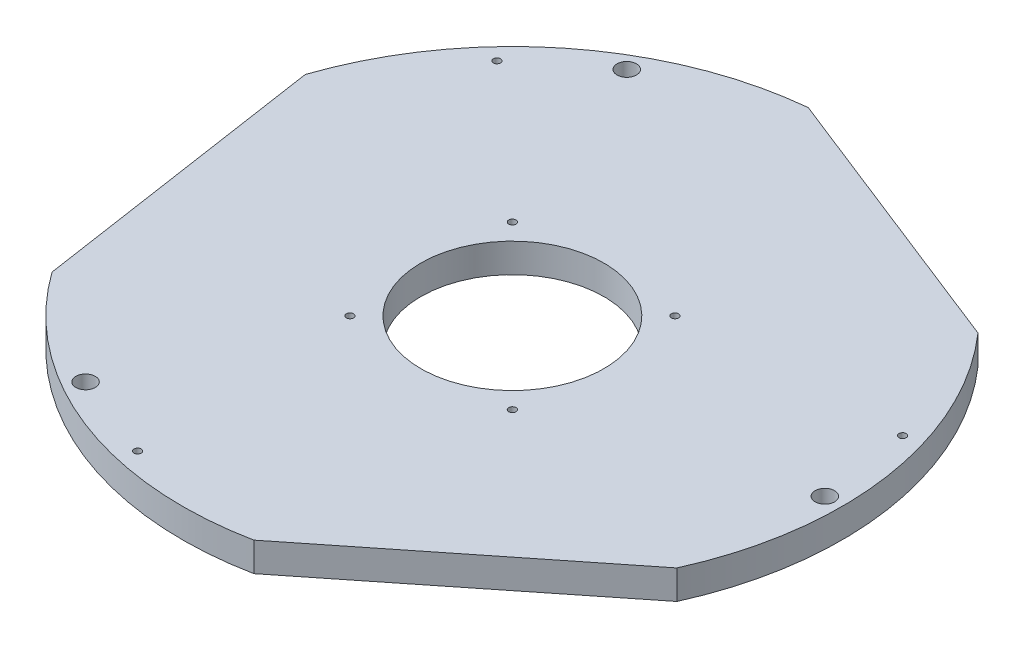
ISO-10303-21;
HEADER;
FILE_DESCRIPTION(('STEP AP214'),'2;1');
FILE_NAME('part.step','',(''),(''),'','','');
FILE_SCHEMA(('AUTOMOTIVE_DESIGN { 1 0 10303 214 1 1 1 1 }'));
ENDSEC;
DATA;
#1=APPLICATION_CONTEXT('core data for automotive mechanical design processes');
#2=APPLICATION_PROTOCOL_DEFINITION('international standard','automotive_design',2000,#1);
#3=PRODUCT_CONTEXT('',#1,'mechanical');
#4=PRODUCT('Part','Part','',(#3));
#5=PRODUCT_RELATED_PRODUCT_CATEGORY('part','',(#4));
#6=PRODUCT_DEFINITION_FORMATION('','',#4);
#7=PRODUCT_DEFINITION_CONTEXT('part definition',#1,'design');
#8=PRODUCT_DEFINITION('design','',#6,#7);
#9=PRODUCT_DEFINITION_SHAPE('','',#8);
#10=(LENGTH_UNIT() NAMED_UNIT(*) SI_UNIT(.MILLI.,.METRE.));
#11=(NAMED_UNIT(*) PLANE_ANGLE_UNIT() SI_UNIT($,.RADIAN.));
#12=(NAMED_UNIT(*) SI_UNIT($,.STERADIAN.) SOLID_ANGLE_UNIT());
#13=UNCERTAINTY_MEASURE_WITH_UNIT(LENGTH_MEASURE(1.E-05),#10,'distance_accuracy_value','');
#14=(GEOMETRIC_REPRESENTATION_CONTEXT(3) GLOBAL_UNCERTAINTY_ASSIGNED_CONTEXT((#13)) GLOBAL_UNIT_ASSIGNED_CONTEXT((#10,
#11,#12)) REPRESENTATION_CONTEXT('',''));
#15=CARTESIAN_POINT('',(0.,0.,0.));
#16=DIRECTION('',(0.,0.,1.));
#17=DIRECTION('',(1.,0.,0.));
#18=AXIS2_PLACEMENT_3D('',#15,#16,#17);
#19=CARTESIAN_POINT('',(144.145000000073,-35.0802222221575,0.));
#20=DIRECTION('',(0.,-1.,0.));
#21=DIRECTION('',(1.,0.,0.));
#22=AXIS2_PLACEMENT_3D('',#19,#20,#21);
#23=PLANE('',#22);
#24=CARTESIAN_POINT('',(-68.2625000000372,-35.0802222221607,118.234118251734));
#25=DIRECTION('',(0.,1.,0.));
#26=DIRECTION('',(0.,0.,1.));
#27=AXIS2_PLACEMENT_3D('',#24,#25,#26);
#28=CIRCLE('',#27,4.24999999999999);
#29=CARTESIAN_POINT('',(-68.2625000000372,-35.0802222221607,122.484118251734));
#30=VERTEX_POINT('',#29);
#31=EDGE_CURVE('E189',#30,#30,#28,.T.);
#32=ORIENTED_EDGE('',*,*,#31,.T.);
#33=EDGE_LOOP('',(#32));
#34=FACE_BOUND('',#33,.T.);
#35=CARTESIAN_POINT('',(1.22682641823028E-13,-35.0802222221599,0.));
#36=DIRECTION('',(0.,1.,0.));
#37=DIRECTION('',(-1.,0.,0.));
#38=AXIS2_PLACEMENT_3D('',#35,#36,#37);
#39=CIRCLE('',#38,40.);
#40=CARTESIAN_POINT('',(-39.9999999999999,-35.08022222216,0.));
#41=VERTEX_POINT('',#40);
#42=EDGE_CURVE('E185',#41,#41,#39,.T.);
#43=ORIENTED_EDGE('',*,*,#42,.T.);
#44=EDGE_LOOP('',(#43));
#45=FACE_BOUND('',#44,.T.);
#46=CARTESIAN_POINT('',(-99.8480641136107,-35.0802222221584,-93.1098261075828));
#47=DIRECTION('',(0.,-1.,0.));
#48=DIRECTION('',(1.,0.,0.));
#49=AXIS2_PLACEMENT_3D('',#46,#47,#48);
#50=CIRCLE('',#49,1.58749999999999);
#51=CARTESIAN_POINT('',(-98.2605641136108,-35.0802222221584,-93.1098261075828));
#52=VERTEX_POINT('',#51);
#53=EDGE_CURVE('E170',#52,#52,#50,.T.);
#54=ORIENTED_EDGE('',*,*,#53,.F.);
#55=EDGE_LOOP('',(#54));
#56=FACE_BOUND('',#55,.T.);
#57=CARTESIAN_POINT('',(130.559506807924,-35.0802222221576,-39.9160469872933));
#58=DIRECTION('',(0.,-1.,0.));
#59=DIRECTION('',(1.,0.,0.));
#60=AXIS2_PLACEMENT_3D('',#57,#58,#59);
#61=CIRCLE('',#60,1.58749999999999);
#62=CARTESIAN_POINT('',(132.147006807924,-35.0802222221576,-39.9160469872933));
#63=VERTEX_POINT('',#62);
#64=EDGE_CURVE('E164',#63,#63,#61,.T.);
#65=ORIENTED_EDGE('',*,*,#64,.F.);
#66=EDGE_LOOP('',(#65));
#67=FACE_BOUND('',#66,.T.);
#68=CARTESIAN_POINT('',(-30.7114426943131,-35.0802222221581,133.025873094876));
#69=DIRECTION('',(0.,-1.,0.));
#70=DIRECTION('',(1.,0.,0.));
#71=AXIS2_PLACEMENT_3D('',#68,#69,#70);
#72=CIRCLE('',#71,1.5875);
#73=CARTESIAN_POINT('',(-29.1239426943131,-35.0802222221581,133.025873094876));
#74=VERTEX_POINT('',#73);
#75=EDGE_CURVE('E158',#74,#74,#72,.T.);
#76=ORIENTED_EDGE('',*,*,#75,.F.);
#77=EDGE_LOOP('',(#76));
#78=FACE_BOUND('',#77,.T.);
#79=CARTESIAN_POINT('',(-35.4999999999999,-35.0802222221581,35.5));
#80=DIRECTION('',(0.,-1.,0.));
#81=DIRECTION('',(1.,0.,0.));
#82=AXIS2_PLACEMENT_3D('',#79,#80,#81);
#83=CIRCLE('',#82,1.5875);
#84=CARTESIAN_POINT('',(-33.9124999999999,-35.0802222221581,35.5));
#85=VERTEX_POINT('',#84);
#86=EDGE_CURVE('E152',#85,#85,#83,.T.);
#87=ORIENTED_EDGE('',*,*,#86,.F.);
#88=EDGE_LOOP('',(#87));
#89=FACE_BOUND('',#88,.T.);
#90=CARTESIAN_POINT('',(-35.4999999999999,-35.0802222221581,-35.5));
#91=DIRECTION('',(0.,-1.,0.));
#92=DIRECTION('',(1.,0.,0.));
#93=AXIS2_PLACEMENT_3D('',#90,#91,#92);
#94=CIRCLE('',#93,1.5875);
#95=CARTESIAN_POINT('',(-33.9124999999999,-35.0802222221581,-35.5));
#96=VERTEX_POINT('',#95);
#97=EDGE_CURVE('E146',#96,#96,#94,.T.);
#98=ORIENTED_EDGE('',*,*,#97,.F.);
#99=EDGE_LOOP('',(#98));
#100=FACE_BOUND('',#99,.T.);
#101=CARTESIAN_POINT('',(35.5000000000001,-35.0802222221579,-35.5));
#102=DIRECTION('',(0.,-1.,0.));
#103=DIRECTION('',(1.,0.,0.));
#104=AXIS2_PLACEMENT_3D('',#101,#102,#103);
#105=CIRCLE('',#104,1.5875);
#106=CARTESIAN_POINT('',(37.0875000000001,-35.0802222221579,-35.5));
#107=VERTEX_POINT('',#106);
#108=EDGE_CURVE('E138',#107,#107,#105,.T.);
#109=ORIENTED_EDGE('',*,*,#108,.F.);
#110=EDGE_LOOP('',(#109));
#111=FACE_BOUND('',#110,.T.);
#112=CARTESIAN_POINT('',(35.5000000000001,-35.0802222221579,35.5));
#113=DIRECTION('',(0.,-1.,0.));
#114=DIRECTION('',(1.,0.,0.));
#115=AXIS2_PLACEMENT_3D('',#112,#113,#114);
#116=CIRCLE('',#115,1.5875);
#117=CARTESIAN_POINT('',(37.0875000000001,-35.0802222221579,35.5));
#118=VERTEX_POINT('',#117);
#119=EDGE_CURVE('E132',#118,#118,#116,.T.);
#120=ORIENTED_EDGE('',*,*,#119,.F.);
#121=EDGE_LOOP('',(#120));
#122=FACE_BOUND('',#121,.T.);
#123=CARTESIAN_POINT('',(1.22682641823001E-13,-35.0802222221489,0.));
#124=DIRECTION('',(0.,-1.,0.));
#125=DIRECTION('',(1.,0.,0.));
#126=AXIS2_PLACEMENT_3D('',#123,#124,#125);
#127=CIRCLE('',#126,144.145000000073);
#128=CARTESIAN_POINT('',(-136.581248266037,-35.0802222221494,-46.079753114707));
#129=VERTEX_POINT('',#128);
#130=CARTESIAN_POINT('',(-14.1746362266186,-35.0802222221589,-143.446368768485));
#131=VERTEX_POINT('',#130);
#132=EDGE_CURVE('E104',#129,#131,#127,.T.);
#133=ORIENTED_EDGE('',*,*,#132,.T.);
#134=DIRECTION('',(0.930417567982025,0.,0.366501226724296));
#135=VECTOR('',#134,1.);
#136=CARTESIAN_POINT('',(171.794102011937,-35.0802222221574,-70.191334639425));
#137=LINE('',#136,#135);
#138=CARTESIAN_POINT('',(108.19686093047,-35.0802222221485,-95.2429541216238));
#139=VERTEX_POINT('',#138);
#140=EDGE_CURVE('E12',#131,#139,#137,.T.);
#141=ORIENTED_EDGE('',*,*,#140,.T.);
#142=CARTESIAN_POINT('',(131.315517547448,-35.0802222221584,59.4475893225875));
#143=VERTEX_POINT('',#142);
#144=EDGE_CURVE('E117',#139,#143,#127,.T.);
#145=ORIENTED_EDGE('',*,*,#144,.T.);
#146=DIRECTION('',(-0.782608156852413,0.,0.62251463663762));
#147=VECTOR('',#146,1.);
#148=CARTESIAN_POINT('',(168.135237305751,-35.0802222221574,30.1598617851895));
#149=LINE('',#148,#147);
#150=CARTESIAN_POINT('',(28.3843873355673,-35.0802222221488,141.322707236331));
#151=VERTEX_POINT('',#150);
#152=EDGE_CURVE('E44',#143,#151,#149,.T.);
#153=ORIENTED_EDGE('',*,*,#152,.T.);
#154=CARTESIAN_POINT('',(-117.140881320829,-35.0802222221593,83.9987794458975));
#155=VERTEX_POINT('',#154);
#156=EDGE_CURVE('E114',#151,#155,#127,.T.);
#157=ORIENTED_EDGE('',*,*,#156,.T.);
#158=DIRECTION('',(-0.147809411129611,0.,-0.989015863361917));
#159=VECTOR('',#158,1.);
#160=CARTESIAN_POINT('',(-123.711839317577,-35.0802222221585,40.0314728542355));
#161=LINE('',#160,#159);
#162=EDGE_CURVE('E112',#155,#129,#161,.T.);
#163=ORIENTED_EDGE('',*,*,#162,.T.);
#164=EDGE_LOOP('',(#133,#141,#145,#153,#157,#163));
#165=FACE_BOUND('',#164,.T.);
#166=CARTESIAN_POINT('',(136.525000000074,-35.08022222216,0.));
#167=DIRECTION('',(0.,1.,0.));
#168=DIRECTION('',(0.,0.,1.));
#169=AXIS2_PLACEMENT_3D('',#166,#167,#168);
#170=CIRCLE('',#169,4.25);
#171=CARTESIAN_POINT('',(136.525000000074,-35.08022222216,4.25));
#172=VERTEX_POINT('',#171);
#173=EDGE_CURVE('E197',#172,#172,#170,.T.);
#174=ORIENTED_EDGE('',*,*,#173,.T.);
#175=EDGE_LOOP('',(#174));
#176=FACE_BOUND('',#175,.T.);
#177=CARTESIAN_POINT('',(-68.2625000000372,-35.0802222221607,-118.234118251734));
#178=DIRECTION('',(0.,1.,0.));
#179=DIRECTION('',(0.,0.,1.));
#180=AXIS2_PLACEMENT_3D('',#177,#178,#179);
#181=CIRCLE('',#180,4.24999999999999);
#182=CARTESIAN_POINT('',(-68.2625000000372,-35.0802222221607,-113.984118251734));
#183=VERTEX_POINT('',#182);
#184=EDGE_CURVE('E203',#183,#183,#181,.T.);
#185=ORIENTED_EDGE('',*,*,#184,.T.);
#186=EDGE_LOOP('',(#185));
#187=FACE_BOUND('',#186,.T.);
#188=ADVANCED_FACE('F36',(#34,#45,#56,#67,#78,#89,#100,#111,#122,#165,#176,#187),#23,.T.);
#189=CARTESIAN_POINT('',(0.,-22.3802222222031,0.));
#190=DIRECTION('',(0.,1.,0.));
#191=DIRECTION('',(-1.,0.,0.));
#192=AXIS2_PLACEMENT_3D('',#189,#190,#191);
#193=PLANE('',#192);
#194=CARTESIAN_POINT('',(-68.2625000000372,-22.3802222222033,-118.234118251734));
#195=DIRECTION('',(0.,1.,0.));
#196=DIRECTION('',(0.,0.,1.));
#197=AXIS2_PLACEMENT_3D('',#194,#195,#196);
#198=CIRCLE('',#197,4.25);
#199=CARTESIAN_POINT('',(-68.2625000000372,-22.3802222222033,-113.984118251734));
#200=VERTEX_POINT('',#199);
#201=EDGE_CURVE('E206',#200,#200,#198,.T.);
#202=ORIENTED_EDGE('',*,*,#201,.F.);
#203=EDGE_LOOP('',(#202));
#204=FACE_BOUND('',#203,.T.);
#205=CARTESIAN_POINT('',(136.525000000074,-22.3802222222026,0.));
#206=DIRECTION('',(0.,1.,0.));
#207=DIRECTION('',(0.,0.,1.));
#208=AXIS2_PLACEMENT_3D('',#205,#206,#207);
#209=CIRCLE('',#208,4.25);
#210=CARTESIAN_POINT('',(136.525000000074,-22.3802222222026,4.25));
#211=VERTEX_POINT('',#210);
#212=EDGE_CURVE('E200',#211,#211,#209,.T.);
#213=ORIENTED_EDGE('',*,*,#212,.F.);
#214=EDGE_LOOP('',(#213));
#215=FACE_BOUND('',#214,.T.);
#216=CARTESIAN_POINT('',(-68.2625000000372,-22.3802222222033,118.234118251734));
#217=DIRECTION('',(0.,1.,0.));
#218=DIRECTION('',(0.,0.,1.));
#219=AXIS2_PLACEMENT_3D('',#216,#217,#218);
#220=CIRCLE('',#219,4.25);
#221=CARTESIAN_POINT('',(-68.2625000000372,-22.3802222222033,122.484118251734));
#222=VERTEX_POINT('',#221);
#223=EDGE_CURVE('E194',#222,#222,#220,.T.);
#224=ORIENTED_EDGE('',*,*,#223,.F.);
#225=EDGE_LOOP('',(#224));
#226=FACE_BOUND('',#225,.T.);
#227=CARTESIAN_POINT('',(0.,-22.3802222222031,0.));
#228=DIRECTION('',(0.,1.,0.));
#229=DIRECTION('',(-1.,0.,0.));
#230=AXIS2_PLACEMENT_3D('',#227,#228,#229);
#231=CIRCLE('',#230,40.);
#232=CARTESIAN_POINT('',(-39.9999999999999,-22.3802222222032,0.));
#233=VERTEX_POINT('',#232);
#234=EDGE_CURVE('E186',#233,#233,#231,.T.);
#235=ORIENTED_EDGE('',*,*,#234,.F.);
#236=EDGE_LOOP('',(#235));
#237=FACE_BOUND('',#236,.T.);
#238=CARTESIAN_POINT('',(-99.8480641136107,-22.3802222222035,-93.1098261075828));
#239=DIRECTION('',(0.,1.,0.));
#240=DIRECTION('',(0.,0.,1.));
#241=AXIS2_PLACEMENT_3D('',#238,#239,#240);
#242=CIRCLE('',#241,1.58749999999999);
#243=CARTESIAN_POINT('',(-99.8480641136107,-22.3802222222035,-91.5223261075828));
#244=VERTEX_POINT('',#243);
#245=EDGE_CURVE('E173',#244,#244,#242,.T.);
#246=ORIENTED_EDGE('',*,*,#245,.F.);
#247=EDGE_LOOP('',(#246));
#248=FACE_BOUND('',#247,.T.);
#249=CARTESIAN_POINT('',(130.559506807924,-22.3802222222026,-39.9160469872933));
#250=DIRECTION('',(0.,1.,0.));
#251=DIRECTION('',(0.,0.,1.));
#252=AXIS2_PLACEMENT_3D('',#249,#250,#251);
#253=CIRCLE('',#252,1.58749999999999);
#254=CARTESIAN_POINT('',(130.559506807924,-22.3802222222026,-38.3285469872933));
#255=VERTEX_POINT('',#254);
#256=EDGE_CURVE('E167',#255,#255,#253,.T.);
#257=ORIENTED_EDGE('',*,*,#256,.F.);
#258=EDGE_LOOP('',(#257));
#259=FACE_BOUND('',#258,.T.);
#260=CARTESIAN_POINT('',(-30.7114426943131,-22.3802222222032,133.025873094876));
#261=DIRECTION('',(0.,1.,0.));
#262=DIRECTION('',(0.,0.,1.));
#263=AXIS2_PLACEMENT_3D('',#260,#261,#262);
#264=CIRCLE('',#263,1.5875);
#265=CARTESIAN_POINT('',(-30.7114426943131,-22.3802222222032,134.613373094876));
#266=VERTEX_POINT('',#265);
#267=EDGE_CURVE('E161',#266,#266,#264,.T.);
#268=ORIENTED_EDGE('',*,*,#267,.F.);
#269=EDGE_LOOP('',(#268));
#270=FACE_BOUND('',#269,.T.);
#271=CARTESIAN_POINT('',(-35.4999999999999,-22.3802222222032,35.5));
#272=DIRECTION('',(0.,1.,0.));
#273=DIRECTION('',(0.,0.,1.));
#274=AXIS2_PLACEMENT_3D('',#271,#272,#273);
#275=CIRCLE('',#274,1.5875);
#276=CARTESIAN_POINT('',(-35.4999999999999,-22.3802222222032,37.0875));
#277=VERTEX_POINT('',#276);
#278=EDGE_CURVE('E155',#277,#277,#275,.T.);
#279=ORIENTED_EDGE('',*,*,#278,.F.);
#280=EDGE_LOOP('',(#279));
#281=FACE_BOUND('',#280,.T.);
#282=CARTESIAN_POINT('',(-35.4999999999999,-22.3802222222032,-35.5));
#283=DIRECTION('',(0.,1.,0.));
#284=DIRECTION('',(0.,0.,1.));
#285=AXIS2_PLACEMENT_3D('',#282,#283,#284);
#286=CIRCLE('',#285,1.5875);
#287=CARTESIAN_POINT('',(-35.4999999999999,-22.3802222222032,-33.9125));
#288=VERTEX_POINT('',#287);
#289=EDGE_CURVE('E149',#288,#288,#286,.T.);
#290=ORIENTED_EDGE('',*,*,#289,.F.);
#291=EDGE_LOOP('',(#290));
#292=FACE_BOUND('',#291,.T.);
#293=CARTESIAN_POINT('',(35.5000000000001,-22.380222222203,-35.5));
#294=DIRECTION('',(0.,1.,0.));
#295=DIRECTION('',(0.,0.,1.));
#296=AXIS2_PLACEMENT_3D('',#293,#294,#295);
#297=CIRCLE('',#296,1.5875);
#298=CARTESIAN_POINT('',(35.5000000000001,-22.380222222203,-33.9125));
#299=VERTEX_POINT('',#298);
#300=EDGE_CURVE('E143',#299,#299,#297,.T.);
#301=ORIENTED_EDGE('',*,*,#300,.F.);
#302=EDGE_LOOP('',(#301));
#303=FACE_BOUND('',#302,.T.);
#304=CARTESIAN_POINT('',(35.5000000000001,-22.380222222203,35.5));
#305=DIRECTION('',(0.,1.,0.));
#306=DIRECTION('',(0.,0.,1.));
#307=AXIS2_PLACEMENT_3D('',#304,#305,#306);
#308=CIRCLE('',#307,1.5875);
#309=CARTESIAN_POINT('',(35.5000000000001,-22.380222222203,37.0875));
#310=VERTEX_POINT('',#309);
#311=EDGE_CURVE('E134',#310,#310,#308,.T.);
#312=ORIENTED_EDGE('',*,*,#311,.F.);
#313=EDGE_LOOP('',(#312));
#314=FACE_BOUND('',#313,.T.);
#315=CARTESIAN_POINT('',(0.,-22.3802222222105,0.));
#316=DIRECTION('',(0.,-1.,0.));
#317=DIRECTION('',(1.,0.,0.));
#318=AXIS2_PLACEMENT_3D('',#315,#316,#317);
#319=CIRCLE('',#318,144.145000000073);
#320=CARTESIAN_POINT('',(108.19686093047,-22.3802222222027,-95.2429541216237));
#321=VERTEX_POINT('',#320);
#322=CARTESIAN_POINT('',(131.315517547448,-22.3802222222026,59.4475893225875));
#323=VERTEX_POINT('',#322);
#324=EDGE_CURVE('E110',#321,#323,#319,.T.);
#325=ORIENTED_EDGE('',*,*,#324,.F.);
#326=DIRECTION('',(-0.930417567982025,0.,-0.366501226724296));
#327=VECTOR('',#326,1.);
#328=CARTESIAN_POINT('',(-159.699904883015,-22.3802222222037,-200.770296558918));
#329=LINE('',#328,#327);
#330=CARTESIAN_POINT('',(-14.1746362266187,-22.3802222222032,-143.446368768485));
#331=VERTEX_POINT('',#330);
#332=EDGE_CURVE('E95',#321,#331,#329,.T.);
#333=ORIENTED_EDGE('',*,*,#332,.T.);
#334=CARTESIAN_POINT('',(-136.581248266037,-22.3802222222036,-46.0797531147071));
#335=VERTEX_POINT('',#334);
#336=EDGE_CURVE('E102',#335,#331,#319,.T.);
#337=ORIENTED_EDGE('',*,*,#336,.F.);
#338=DIRECTION('',(0.147809411129611,0.,0.989015863361917));
#339=VECTOR('',#338,1.);
#340=CARTESIAN_POINT('',(-94.0222247038509,-22.3802222222034,238.689322890109));
#341=LINE('',#340,#339);
#342=CARTESIAN_POINT('',(-117.140881320829,-22.3802222222035,83.9987794458976));
#343=VERTEX_POINT('',#342);
#344=EDGE_CURVE('E86',#335,#343,#341,.T.);
#345=ORIENTED_EDGE('',*,*,#344,.T.);
#346=CARTESIAN_POINT('',(28.3843873355672,-22.380222222203,141.322707236331));
#347=VERTEX_POINT('',#346);
#348=EDGE_CURVE('E109',#347,#343,#319,.T.);
#349=ORIENTED_EDGE('',*,*,#348,.F.);
#350=DIRECTION('',(0.782608156852413,0.,-0.62251463663762));
#351=VECTOR('',#350,1.);
#352=CARTESIAN_POINT('',(253.722129586866,-22.3802222222022,-37.9190263311905));
#353=LINE('',#352,#351);
#354=EDGE_CURVE('E94',#347,#323,#353,.T.);
#355=ORIENTED_EDGE('',*,*,#354,.T.);
#356=EDGE_LOOP('',(#325,#333,#337,#345,#349,#355));
#357=FACE_BOUND('',#356,.T.);
#358=ADVANCED_FACE('F38',(#204,#215,#226,#237,#248,#259,#270,#281,#292,#303,#314,#357),#193,.T.);
#359=CARTESIAN_POINT('',(6.99440505513849E-10,-200000.,0.));
#360=DIRECTION('',(0.,-1.,0.));
#361=DIRECTION('',(1.,0.,0.));
#362=AXIS2_PLACEMENT_3D('',#359,#360,#361);
#363=CYLINDRICAL_SURFACE('',#362,144.145000000073);
#364=ORIENTED_EDGE('',*,*,#144,.F.);
#365=DIRECTION('',(0.,-1.,0.));
#366=VECTOR('',#365,1.);
#367=CARTESIAN_POINT('',(108.196860931169,-200000.,-95.2429541216237));
#368=LINE('',#367,#366);
#369=EDGE_CURVE('E51',#139,#321,#368,.F.);
#370=ORIENTED_EDGE('',*,*,#369,.T.);
#371=ORIENTED_EDGE('',*,*,#324,.T.);
#372=DIRECTION('',(0.,-1.,0.));
#373=VECTOR('',#372,1.);
#374=CARTESIAN_POINT('',(131.315517548147,-200000.,59.4475893225875));
#375=LINE('',#374,#373);
#376=EDGE_CURVE('E105',#323,#143,#375,.T.);
#377=ORIENTED_EDGE('',*,*,#376,.T.);
#378=EDGE_LOOP('',(#364,#370,#371,#377));
#379=FACE_BOUND('',#378,.T.);
#380=ADVANCED_FACE('F214',(#379),#363,.T.);
#381=ORIENTED_EDGE('',*,*,#336,.T.);
#382=DIRECTION('',(0.,-1.,0.));
#383=VECTOR('',#382,1.);
#384=CARTESIAN_POINT('',(-14.1746362259194,-200000.,-143.446368768485));
#385=LINE('',#384,#383);
#386=EDGE_CURVE('E177',#331,#131,#385,.T.);
#387=ORIENTED_EDGE('',*,*,#386,.T.);
#388=ORIENTED_EDGE('',*,*,#132,.F.);
#389=DIRECTION('',(0.,-1.,0.));
#390=VECTOR('',#389,1.);
#391=CARTESIAN_POINT('',(-136.581248265337,-200000.,-46.0797531147072));
#392=LINE('',#391,#390);
#393=EDGE_CURVE('E58',#129,#335,#392,.F.);
#394=ORIENTED_EDGE('',*,*,#393,.T.);
#395=EDGE_LOOP('',(#381,#387,#388,#394));
#396=FACE_BOUND('',#395,.T.);
#397=ADVANCED_FACE('F100',(#396),#363,.T.);
#398=ORIENTED_EDGE('',*,*,#156,.F.);
#399=DIRECTION('',(0.,-1.,0.));
#400=VECTOR('',#399,1.);
#401=CARTESIAN_POINT('',(28.3843873362666,-200000.,141.322707236331));
#402=LINE('',#401,#400);
#403=EDGE_CURVE('E131',#151,#347,#402,.F.);
#404=ORIENTED_EDGE('',*,*,#403,.T.);
#405=ORIENTED_EDGE('',*,*,#348,.T.);
#406=DIRECTION('',(0.,-1.,0.));
#407=VECTOR('',#406,1.);
#408=CARTESIAN_POINT('',(-117.14088132013,-200000.,83.9987794458977));
#409=LINE('',#408,#407);
#410=EDGE_CURVE('E89',#343,#155,#409,.T.);
#411=ORIENTED_EDGE('',*,*,#410,.T.);
#412=EDGE_LOOP('',(#398,#404,#405,#411));
#413=FACE_BOUND('',#412,.T.);
#414=ADVANCED_FACE('F130',(#413),#363,.T.);
#415=CARTESIAN_POINT('',(35.5000000000001,-22.380222222203,35.5));
#416=DIRECTION('',(0.,1.,0.));
#417=DIRECTION('',(0.,0.,1.));
#418=AXIS2_PLACEMENT_3D('',#415,#416,#417);
#419=CYLINDRICAL_SURFACE('',#418,1.5875);
#420=ORIENTED_EDGE('',*,*,#311,.T.);
#421=EDGE_LOOP('',(#420));
#422=FACE_BOUND('',#421,.T.);
#423=ORIENTED_EDGE('',*,*,#119,.T.);
#424=EDGE_LOOP('',(#423));
#425=FACE_BOUND('',#424,.T.);
#426=ADVANCED_FACE('F235',(#422,#425),#419,.F.);
#427=CARTESIAN_POINT('',(35.5000000000001,-22.380222222203,-35.5));
#428=DIRECTION('',(0.,1.,0.));
#429=DIRECTION('',(0.,0.,1.));
#430=AXIS2_PLACEMENT_3D('',#427,#428,#429);
#431=CYLINDRICAL_SURFACE('',#430,1.5875);
#432=ORIENTED_EDGE('',*,*,#300,.T.);
#433=EDGE_LOOP('',(#432));
#434=FACE_BOUND('',#433,.T.);
#435=ORIENTED_EDGE('',*,*,#108,.T.);
#436=EDGE_LOOP('',(#435));
#437=FACE_BOUND('',#436,.T.);
#438=ADVANCED_FACE('F237',(#434,#437),#431,.F.);
#439=CARTESIAN_POINT('',(-35.4999999999999,-22.3802222222032,-35.5));
#440=DIRECTION('',(0.,1.,0.));
#441=DIRECTION('',(0.,0.,1.));
#442=AXIS2_PLACEMENT_3D('',#439,#440,#441);
#443=CYLINDRICAL_SURFACE('',#442,1.5875);
#444=ORIENTED_EDGE('',*,*,#289,.T.);
#445=EDGE_LOOP('',(#444));
#446=FACE_BOUND('',#445,.T.);
#447=ORIENTED_EDGE('',*,*,#97,.T.);
#448=EDGE_LOOP('',(#447));
#449=FACE_BOUND('',#448,.T.);
#450=ADVANCED_FACE('F243',(#446,#449),#443,.F.);
#451=CARTESIAN_POINT('',(-35.4999999999999,-22.3802222222032,35.5));
#452=DIRECTION('',(0.,1.,0.));
#453=DIRECTION('',(0.,0.,1.));
#454=AXIS2_PLACEMENT_3D('',#451,#452,#453);
#455=CYLINDRICAL_SURFACE('',#454,1.5875);
#456=ORIENTED_EDGE('',*,*,#278,.T.);
#457=EDGE_LOOP('',(#456));
#458=FACE_BOUND('',#457,.T.);
#459=ORIENTED_EDGE('',*,*,#86,.T.);
#460=EDGE_LOOP('',(#459));
#461=FACE_BOUND('',#460,.T.);
#462=ADVANCED_FACE('F282',(#458,#461),#455,.F.);
#463=CARTESIAN_POINT('',(-30.7114426943131,-22.3802222222032,133.025873094876));
#464=DIRECTION('',(0.,1.,0.));
#465=DIRECTION('',(0.,0.,1.));
#466=AXIS2_PLACEMENT_3D('',#463,#464,#465);
#467=CYLINDRICAL_SURFACE('',#466,1.5875);
#468=ORIENTED_EDGE('',*,*,#267,.T.);
#469=EDGE_LOOP('',(#468));
#470=FACE_BOUND('',#469,.T.);
#471=ORIENTED_EDGE('',*,*,#75,.T.);
#472=EDGE_LOOP('',(#471));
#473=FACE_BOUND('',#472,.T.);
#474=ADVANCED_FACE('F278',(#470,#473),#467,.F.);
#475=CARTESIAN_POINT('',(130.559506807924,-22.3802222222026,-39.9160469872933));
#476=DIRECTION('',(0.,1.,0.));
#477=DIRECTION('',(0.,0.,1.));
#478=AXIS2_PLACEMENT_3D('',#475,#476,#477);
#479=CYLINDRICAL_SURFACE('',#478,1.58749999999999);
#480=ORIENTED_EDGE('',*,*,#256,.T.);
#481=EDGE_LOOP('',(#480));
#482=FACE_BOUND('',#481,.T.);
#483=ORIENTED_EDGE('',*,*,#64,.T.);
#484=EDGE_LOOP('',(#483));
#485=FACE_BOUND('',#484,.T.);
#486=ADVANCED_FACE('F274',(#482,#485),#479,.F.);
#487=CARTESIAN_POINT('',(-99.8480641136107,-22.3802222222035,-93.1098261075828));
#488=DIRECTION('',(0.,1.,0.));
#489=DIRECTION('',(0.,0.,1.));
#490=AXIS2_PLACEMENT_3D('',#487,#488,#489);
#491=CYLINDRICAL_SURFACE('',#490,1.58749999999999);
#492=ORIENTED_EDGE('',*,*,#245,.T.);
#493=EDGE_LOOP('',(#492));
#494=FACE_BOUND('',#493,.T.);
#495=ORIENTED_EDGE('',*,*,#53,.T.);
#496=EDGE_LOOP('',(#495));
#497=FACE_BOUND('',#496,.T.);
#498=ADVANCED_FACE('F267',(#494,#497),#491,.F.);
#499=CARTESIAN_POINT('',(-94.0222247038509,-35.0802222221592,238.689322890109));
#500=DIRECTION('',(-0.989015863361917,0.,0.147809411129611));
#501=DIRECTION('',(0.147809411129611,0.,0.989015863361917));
#502=AXIS2_PLACEMENT_3D('',#499,#500,#501);
#503=PLANE('',#502);
#504=ORIENTED_EDGE('',*,*,#162,.F.);
#505=ORIENTED_EDGE('',*,*,#410,.F.);
#506=ORIENTED_EDGE('',*,*,#344,.F.);
#507=ORIENTED_EDGE('',*,*,#393,.F.);
#508=EDGE_LOOP('',(#504,#505,#506,#507));
#509=FACE_BOUND('',#508,.T.);
#510=ADVANCED_FACE('F87',(#509),#503,.T.);
#511=CARTESIAN_POINT('',(253.722129586866,-35.080222222158,-37.9190263311905));
#512=DIRECTION('',(0.62251463663762,0.,0.782608156852413));
#513=DIRECTION('',(0.782608156852413,0.,-0.62251463663762));
#514=AXIS2_PLACEMENT_3D('',#511,#512,#513);
#515=PLANE('',#514);
#516=ORIENTED_EDGE('',*,*,#152,.F.);
#517=ORIENTED_EDGE('',*,*,#376,.F.);
#518=ORIENTED_EDGE('',*,*,#354,.F.);
#519=ORIENTED_EDGE('',*,*,#403,.F.);
#520=EDGE_LOOP('',(#516,#517,#518,#519));
#521=FACE_BOUND('',#520,.T.);
#522=ADVANCED_FACE('F257',(#521),#515,.T.);
#523=CARTESIAN_POINT('',(-159.699904883015,-35.0802222221594,-200.770296558918));
#524=DIRECTION('',(0.366501226724296,0.,-0.930417567982025));
#525=DIRECTION('',(-0.930417567982025,0.,-0.366501226724296));
#526=AXIS2_PLACEMENT_3D('',#523,#524,#525);
#527=PLANE('',#526);
#528=ORIENTED_EDGE('',*,*,#140,.F.);
#529=ORIENTED_EDGE('',*,*,#386,.F.);
#530=ORIENTED_EDGE('',*,*,#332,.F.);
#531=ORIENTED_EDGE('',*,*,#369,.F.);
#532=EDGE_LOOP('',(#528,#529,#530,#531));
#533=FACE_BOUND('',#532,.T.);
#534=ADVANCED_FACE('F259',(#533),#527,.T.);
#535=CARTESIAN_POINT('',(1.22682641823028E-13,-35.0802222221599,0.));
#536=DIRECTION('',(0.,1.,0.));
#537=DIRECTION('',(-1.,0.,0.));
#538=AXIS2_PLACEMENT_3D('',#535,#536,#537);
#539=CYLINDRICAL_SURFACE('',#538,40.);
#540=ORIENTED_EDGE('',*,*,#42,.F.);
#541=EDGE_LOOP('',(#540));
#542=FACE_BOUND('',#541,.T.);
#543=ORIENTED_EDGE('',*,*,#234,.T.);
#544=EDGE_LOOP('',(#543));
#545=FACE_BOUND('',#544,.T.);
#546=ADVANCED_FACE('F265',(#542,#545),#539,.F.);
#547=CARTESIAN_POINT('',(-68.2625000000372,-22.3802222222033,118.234118251734));
#548=DIRECTION('',(0.,1.,0.));
#549=DIRECTION('',(0.,0.,1.));
#550=AXIS2_PLACEMENT_3D('',#547,#548,#549);
#551=CYLINDRICAL_SURFACE('',#550,4.25);
#552=ORIENTED_EDGE('',*,*,#31,.F.);
#553=EDGE_LOOP('',(#552));
#554=FACE_BOUND('',#553,.T.);
#555=ORIENTED_EDGE('',*,*,#223,.T.);
#556=EDGE_LOOP('',(#555));
#557=FACE_BOUND('',#556,.T.);
#558=ADVANCED_FACE('F343',(#554,#557),#551,.F.);
#559=CARTESIAN_POINT('',(136.525000000074,-22.3802222222026,0.));
#560=DIRECTION('',(0.,1.,0.));
#561=DIRECTION('',(0.,0.,1.));
#562=AXIS2_PLACEMENT_3D('',#559,#560,#561);
#563=CYLINDRICAL_SURFACE('',#562,4.25);
#564=ORIENTED_EDGE('',*,*,#173,.F.);
#565=EDGE_LOOP('',(#564));
#566=FACE_BOUND('',#565,.T.);
#567=ORIENTED_EDGE('',*,*,#212,.T.);
#568=EDGE_LOOP('',(#567));
#569=FACE_BOUND('',#568,.T.);
#570=ADVANCED_FACE('F364',(#566,#569),#563,.F.);
#571=CARTESIAN_POINT('',(-68.2625000000372,-22.3802222222033,-118.234118251734));
#572=DIRECTION('',(0.,1.,0.));
#573=DIRECTION('',(0.,0.,1.));
#574=AXIS2_PLACEMENT_3D('',#571,#572,#573);
#575=CYLINDRICAL_SURFACE('',#574,4.25);
#576=ORIENTED_EDGE('',*,*,#184,.F.);
#577=EDGE_LOOP('',(#576));
#578=FACE_BOUND('',#577,.T.);
#579=ORIENTED_EDGE('',*,*,#201,.T.);
#580=EDGE_LOOP('',(#579));
#581=FACE_BOUND('',#580,.T.);
#582=ADVANCED_FACE('F210',(#578,#581),#575,.F.);
#583=CLOSED_SHELL('',(#188,#358,#380,#397,#414,#426,#438,#450,#462,#474,#486,#498,#510,#522,
#534,#546,#558,#570,#582));
#584=MANIFOLD_SOLID_BREP('B2',#583);
#585=ADVANCED_BREP_SHAPE_REPRESENTATION('',(#18,#584),#14);
#586=SHAPE_DEFINITION_REPRESENTATION(#9,#585);
ENDSEC;
END-ISO-10303-21;
